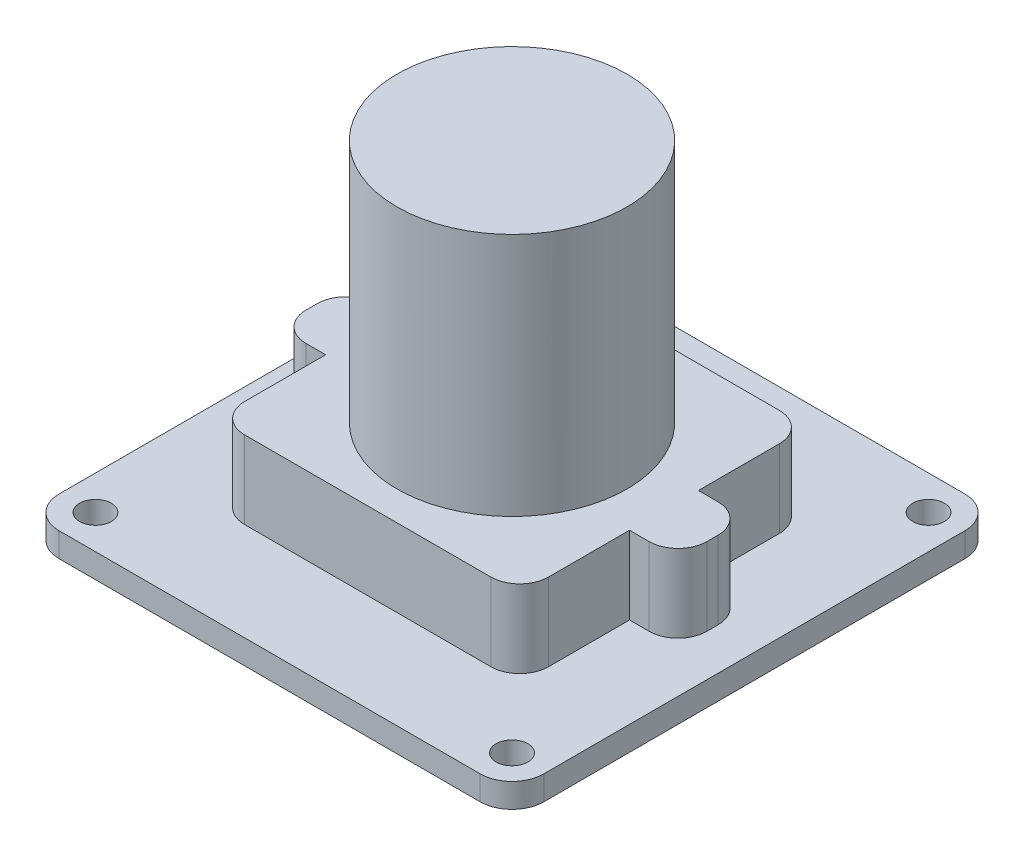
ISO-10303-21;
HEADER;
FILE_DESCRIPTION(('STEP AP214'),'2;1');
FILE_NAME('part.step','',(''),(''),'','','');
FILE_SCHEMA(('AUTOMOTIVE_DESIGN { 1 0 10303 214 1 1 1 1 }'));
ENDSEC;
DATA;
#1=APPLICATION_CONTEXT('core data for automotive mechanical design processes');
#2=APPLICATION_PROTOCOL_DEFINITION('international standard','automotive_design',2000,#1);
#3=PRODUCT_CONTEXT('',#1,'mechanical');
#4=PRODUCT('Part','Part','',(#3));
#5=PRODUCT_RELATED_PRODUCT_CATEGORY('part','',(#4));
#6=PRODUCT_DEFINITION_FORMATION('','',#4);
#7=PRODUCT_DEFINITION_CONTEXT('part definition',#1,'design');
#8=PRODUCT_DEFINITION('design','',#6,#7);
#9=PRODUCT_DEFINITION_SHAPE('','',#8);
#10=(LENGTH_UNIT() NAMED_UNIT(*) SI_UNIT(.MILLI.,.METRE.));
#11=(NAMED_UNIT(*) PLANE_ANGLE_UNIT() SI_UNIT($,.RADIAN.));
#12=(NAMED_UNIT(*) SI_UNIT($,.STERADIAN.) SOLID_ANGLE_UNIT());
#13=UNCERTAINTY_MEASURE_WITH_UNIT(LENGTH_MEASURE(1.E-05),#10,'distance_accuracy_value','');
#14=(GEOMETRIC_REPRESENTATION_CONTEXT(3) GLOBAL_UNCERTAINTY_ASSIGNED_CONTEXT((#13)) GLOBAL_UNIT_ASSIGNED_CONTEXT((#10,
#11,#12)) REPRESENTATION_CONTEXT('',''));
#15=CARTESIAN_POINT('',(0.,0.,0.));
#16=DIRECTION('',(0.,0.,1.));
#17=DIRECTION('',(1.,0.,0.));
#18=AXIS2_PLACEMENT_3D('',#15,#16,#17);
#19=CARTESIAN_POINT('',(0.,1.6002,0.));
#20=DIRECTION('',(0.,1.,0.));
#21=DIRECTION('',(0.,0.,1.));
#22=AXIS2_PLACEMENT_3D('',#19,#20,#21);
#23=PLANE('',#22);
#24=CARTESIAN_POINT('',(-13.75,1.6002,13.7500106));
#25=DIRECTION('',(0.,1.,0.));
#26=DIRECTION('',(0.,0.,1.));
#27=AXIS2_PLACEMENT_3D('',#24,#25,#26);
#28=CIRCLE('',#27,1.04775);
#29=CARTESIAN_POINT('',(-13.75,1.6002,14.7977606));
#30=VERTEX_POINT('',#29);
#31=EDGE_CURVE('E301',#30,#30,#28,.T.);
#32=ORIENTED_EDGE('',*,*,#31,.F.);
#33=EDGE_LOOP('',(#32));
#34=FACE_BOUND('',#33,.T.);
#35=CARTESIAN_POINT('',(13.7500106,1.6002,-13.7500106));
#36=DIRECTION('',(0.,1.,0.));
#37=DIRECTION('',(0.,0.,1.));
#38=AXIS2_PLACEMENT_3D('',#35,#36,#37);
#39=CIRCLE('',#38,1.04775);
#40=CARTESIAN_POINT('',(13.7500106,1.6002,-12.7022606));
#41=VERTEX_POINT('',#40);
#42=EDGE_CURVE('E317',#41,#41,#39,.T.);
#43=ORIENTED_EDGE('',*,*,#42,.F.);
#44=EDGE_LOOP('',(#43));
#45=FACE_BOUND('',#44,.T.);
#46=DIRECTION('',(-1.,0.,0.));
#47=VECTOR('',#46,1.);
#48=CARTESIAN_POINT('',(-16.,1.6002,-16.));
#49=LINE('',#48,#47);
#50=CARTESIAN_POINT('',(13.9,1.6002,-16.));
#51=VERTEX_POINT('',#50);
#52=CARTESIAN_POINT('',(-13.9,1.6002,-16.));
#53=VERTEX_POINT('',#52);
#54=EDGE_CURVE('E335',#51,#53,#49,.T.);
#55=ORIENTED_EDGE('',*,*,#54,.T.);
#56=CARTESIAN_POINT('',(-13.9,1.6002,-13.9));
#57=DIRECTION('',(0.,1.,0.));
#58=DIRECTION('',(0.,0.,1.));
#59=AXIS2_PLACEMENT_3D('',#56,#57,#58);
#60=CIRCLE('',#59,2.1);
#61=CARTESIAN_POINT('',(-16.,1.6002,-13.9));
#62=VERTEX_POINT('',#61);
#63=EDGE_CURVE('E379',#53,#62,#60,.T.);
#64=ORIENTED_EDGE('',*,*,#63,.T.);
#65=DIRECTION('',(0.,0.,1.));
#66=VECTOR('',#65,1.);
#67=CARTESIAN_POINT('',(-16.,1.6002,-16.));
#68=LINE('',#67,#66);
#69=CARTESIAN_POINT('',(-16.,1.6002,13.9));
#70=VERTEX_POINT('',#69);
#71=EDGE_CURVE('E323',#62,#70,#68,.T.);
#72=ORIENTED_EDGE('',*,*,#71,.T.);
#73=CARTESIAN_POINT('',(-13.9,1.6002,13.9));
#74=DIRECTION('',(0.,1.,0.));
#75=DIRECTION('',(0.,0.,1.));
#76=AXIS2_PLACEMENT_3D('',#73,#74,#75);
#77=CIRCLE('',#76,2.1);
#78=CARTESIAN_POINT('',(-13.9,1.6002,16.));
#79=VERTEX_POINT('',#78);
#80=EDGE_CURVE('E372',#70,#79,#77,.T.);
#81=ORIENTED_EDGE('',*,*,#80,.T.);
#82=DIRECTION('',(1.,0.,0.));
#83=VECTOR('',#82,1.);
#84=CARTESIAN_POINT('',(-16.,1.6002,16.));
#85=LINE('',#84,#83);
#86=CARTESIAN_POINT('',(13.9,1.6002,16.));
#87=VERTEX_POINT('',#86);
#88=EDGE_CURVE('E327',#79,#87,#85,.T.);
#89=ORIENTED_EDGE('',*,*,#88,.T.);
#90=CARTESIAN_POINT('',(13.9,1.6002,13.9));
#91=DIRECTION('',(0.,1.,0.));
#92=DIRECTION('',(0.,0.,1.));
#93=AXIS2_PLACEMENT_3D('',#90,#91,#92);
#94=CIRCLE('',#93,2.1);
#95=CARTESIAN_POINT('',(16.,1.6002,13.9));
#96=VERTEX_POINT('',#95);
#97=EDGE_CURVE('E375',#87,#96,#94,.T.);
#98=ORIENTED_EDGE('',*,*,#97,.T.);
#99=DIRECTION('',(0.,0.,-1.));
#100=VECTOR('',#99,1.);
#101=CARTESIAN_POINT('',(16.,1.6002,-16.));
#102=LINE('',#101,#100);
#103=CARTESIAN_POINT('',(16.,1.6002,-13.9));
#104=VERTEX_POINT('',#103);
#105=EDGE_CURVE('E332',#96,#104,#102,.T.);
#106=ORIENTED_EDGE('',*,*,#105,.T.);
#107=CARTESIAN_POINT('',(13.9,1.6002,-13.9));
#108=DIRECTION('',(0.,1.,0.));
#109=DIRECTION('',(0.,0.,1.));
#110=AXIS2_PLACEMENT_3D('',#107,#108,#109);
#111=CIRCLE('',#110,2.1);
#112=EDGE_CURVE('E377',#104,#51,#111,.T.);
#113=ORIENTED_EDGE('',*,*,#112,.T.);
#114=EDGE_LOOP('',(#55,#64,#72,#81,#89,#98,#106,#113));
#115=FACE_BOUND('',#114,.T.);
#116=CARTESIAN_POINT('',(-13.7500106,1.6002,-13.7500106));
#117=DIRECTION('',(0.,1.,0.));
#118=DIRECTION('',(0.,0.,1.));
#119=AXIS2_PLACEMENT_3D('',#116,#117,#118);
#120=CIRCLE('',#119,1.04775);
#121=CARTESIAN_POINT('',(-13.7500106,1.6002,-12.7022606));
#122=VERTEX_POINT('',#121);
#123=EDGE_CURVE('E309',#122,#122,#120,.T.);
#124=ORIENTED_EDGE('',*,*,#123,.F.);
#125=EDGE_LOOP('',(#124));
#126=FACE_BOUND('',#125,.T.);
#127=CARTESIAN_POINT('',(13.7500106,1.6002,13.7500106));
#128=DIRECTION('',(0.,1.,0.));
#129=DIRECTION('',(0.,0.,1.));
#130=AXIS2_PLACEMENT_3D('',#127,#128,#129);
#131=CIRCLE('',#130,1.04775);
#132=CARTESIAN_POINT('',(13.7500106,1.6002,14.7977606));
#133=VERTEX_POINT('',#132);
#134=EDGE_CURVE('E290',#133,#133,#131,.T.);
#135=ORIENTED_EDGE('',*,*,#134,.F.);
#136=EDGE_LOOP('',(#135));
#137=FACE_BOUND('',#136,.T.);
#138=DIRECTION('',(-1.,0.,0.));
#139=VECTOR('',#138,1.);
#140=CARTESIAN_POINT('',(-10.033,1.6002,-2.2733));
#141=LINE('',#140,#139);
#142=CARTESIAN_POINT('',(-10.033,1.6002,-2.2733));
#143=VERTEX_POINT('',#142);
#144=CARTESIAN_POINT('',(-11.3284,1.6002,-2.2733));
#145=VERTEX_POINT('',#144);
#146=EDGE_CURVE('E482',#143,#145,#141,.T.);
#147=ORIENTED_EDGE('',*,*,#146,.F.);
#148=DIRECTION('',(0.,0.,1.));
#149=VECTOR('',#148,1.);
#150=CARTESIAN_POINT('',(-10.033,1.6002,-9.525));
#151=LINE('',#150,#149);
#152=CARTESIAN_POINT('',(-10.033,1.6002,-7.62));
#153=VERTEX_POINT('',#152);
#154=EDGE_CURVE('E284',#153,#143,#151,.T.);
#155=ORIENTED_EDGE('',*,*,#154,.F.);
#156=CARTESIAN_POINT('',(-8.128,1.6002,-7.62));
#157=DIRECTION('',(0.,1.,0.));
#158=DIRECTION('',(0.,0.,1.));
#159=AXIS2_PLACEMENT_3D('',#156,#157,#158);
#160=CIRCLE('',#159,1.905);
#161=CARTESIAN_POINT('',(-8.128,1.6002,-9.525));
#162=VERTEX_POINT('',#161);
#163=EDGE_CURVE('E69',#153,#162,#160,.F.);
#164=ORIENTED_EDGE('',*,*,#163,.T.);
#165=DIRECTION('',(-1.,0.,0.));
#166=VECTOR('',#165,1.);
#167=CARTESIAN_POINT('',(-10.033,1.6002,-9.525));
#168=LINE('',#167,#166);
#169=CARTESIAN_POINT('',(8.128,1.6002,-9.525));
#170=VERTEX_POINT('',#169);
#171=EDGE_CURVE('E270',#170,#162,#168,.T.);
#172=ORIENTED_EDGE('',*,*,#171,.F.);
#173=CARTESIAN_POINT('',(8.128,1.6002,-7.62));
#174=DIRECTION('',(0.,1.,0.));
#175=DIRECTION('',(0.,0.,1.));
#176=AXIS2_PLACEMENT_3D('',#173,#174,#175);
#177=CIRCLE('',#176,1.905);
#178=CARTESIAN_POINT('',(10.033,1.6002,-7.62));
#179=VERTEX_POINT('',#178);
#180=EDGE_CURVE('E54',#170,#179,#177,.F.);
#181=ORIENTED_EDGE('',*,*,#180,.T.);
#182=DIRECTION('',(0.,0.,-1.));
#183=VECTOR('',#182,1.);
#184=CARTESIAN_POINT('',(10.033,1.6002,-9.525));
#185=LINE('',#184,#183);
#186=CARTESIAN_POINT('',(10.033,1.6002,-2.2733));
#187=VERTEX_POINT('',#186);
#188=EDGE_CURVE('E475',#187,#179,#185,.T.);
#189=ORIENTED_EDGE('',*,*,#188,.F.);
#190=DIRECTION('',(-1.,0.,0.));
#191=VECTOR('',#190,1.);
#192=CARTESIAN_POINT('',(10.033,1.6002,-2.2733));
#193=LINE('',#192,#191);
#194=CARTESIAN_POINT('',(11.3284,1.6002,-2.2733));
#195=VERTEX_POINT('',#194);
#196=EDGE_CURVE('E539',#195,#187,#193,.T.);
#197=ORIENTED_EDGE('',*,*,#196,.F.);
#198=CARTESIAN_POINT('',(11.3284,1.6002,-0.368300000000005));
#199=DIRECTION('',(0.,1.,0.));
#200=DIRECTION('',(0.,0.,1.));
#201=AXIS2_PLACEMENT_3D('',#198,#199,#200);
#202=CIRCLE('',#201,1.905);
#203=CARTESIAN_POINT('',(13.2334,1.6002,-0.368300000000005));
#204=VERTEX_POINT('',#203);
#205=EDGE_CURVE('E458',#195,#204,#202,.F.);
#206=ORIENTED_EDGE('',*,*,#205,.T.);
#207=DIRECTION('',(0.,0.,-1.));
#208=VECTOR('',#207,1.);
#209=CARTESIAN_POINT('',(13.2334,1.6002,-2.27330000000001));
#210=LINE('',#209,#208);
#211=CARTESIAN_POINT('',(13.2334,1.6002,0.368300000000002));
#212=VERTEX_POINT('',#211);
#213=EDGE_CURVE('E536',#212,#204,#210,.T.);
#214=ORIENTED_EDGE('',*,*,#213,.F.);
#215=CARTESIAN_POINT('',(11.3284,1.6002,0.368300000000002));
#216=DIRECTION('',(0.,1.,0.));
#217=DIRECTION('',(0.,0.,1.));
#218=AXIS2_PLACEMENT_3D('',#215,#216,#217);
#219=CIRCLE('',#218,1.905);
#220=CARTESIAN_POINT('',(11.3284,1.6002,2.2733));
#221=VERTEX_POINT('',#220);
#222=EDGE_CURVE('E460',#212,#221,#219,.F.);
#223=ORIENTED_EDGE('',*,*,#222,.T.);
#224=DIRECTION('',(1.,0.,0.));
#225=VECTOR('',#224,1.);
#226=CARTESIAN_POINT('',(13.2334,1.6002,2.2733));
#227=LINE('',#226,#225);
#228=CARTESIAN_POINT('',(10.033,1.6002,2.2733));
#229=VERTEX_POINT('',#228);
#230=EDGE_CURVE('E533',#229,#221,#227,.T.);
#231=ORIENTED_EDGE('',*,*,#230,.F.);
#232=DIRECTION('',(0.,0.,-1.));
#233=VECTOR('',#232,1.);
#234=CARTESIAN_POINT('',(10.033,1.6002,2.2733));
#235=LINE('',#234,#233);
#236=CARTESIAN_POINT('',(10.033,1.6002,7.62));
#237=VERTEX_POINT('',#236);
#238=EDGE_CURVE('E497',#237,#229,#235,.T.);
#239=ORIENTED_EDGE('',*,*,#238,.F.);
#240=CARTESIAN_POINT('',(8.128,1.6002,7.62));
#241=DIRECTION('',(0.,1.,0.));
#242=DIRECTION('',(0.,0.,1.));
#243=AXIS2_PLACEMENT_3D('',#240,#241,#242);
#244=CIRCLE('',#243,1.905);
#245=CARTESIAN_POINT('',(8.128,1.6002,9.525));
#246=VERTEX_POINT('',#245);
#247=EDGE_CURVE('E462',#237,#246,#244,.F.);
#248=ORIENTED_EDGE('',*,*,#247,.T.);
#249=DIRECTION('',(1.,0.,0.));
#250=VECTOR('',#249,1.);
#251=CARTESIAN_POINT('',(-10.033,1.6002,9.525));
#252=LINE('',#251,#250);
#253=CARTESIAN_POINT('',(-8.128,1.6002,9.525));
#254=VERTEX_POINT('',#253);
#255=EDGE_CURVE('E493',#254,#246,#252,.T.);
#256=ORIENTED_EDGE('',*,*,#255,.F.);
#257=CARTESIAN_POINT('',(-8.128,1.6002,7.62));
#258=DIRECTION('',(0.,1.,0.));
#259=DIRECTION('',(0.,0.,1.));
#260=AXIS2_PLACEMENT_3D('',#257,#258,#259);
#261=CIRCLE('',#260,1.905);
#262=CARTESIAN_POINT('',(-10.033,1.6002,7.62));
#263=VERTEX_POINT('',#262);
#264=EDGE_CURVE('E464',#254,#263,#261,.F.);
#265=ORIENTED_EDGE('',*,*,#264,.T.);
#266=DIRECTION('',(0.,0.,1.));
#267=VECTOR('',#266,1.);
#268=CARTESIAN_POINT('',(-10.033,1.6002,2.2733));
#269=LINE('',#268,#267);
#270=CARTESIAN_POINT('',(-10.033,1.6002,2.2733));
#271=VERTEX_POINT('',#270);
#272=EDGE_CURVE('E489',#271,#263,#269,.T.);
#273=ORIENTED_EDGE('',*,*,#272,.F.);
#274=DIRECTION('',(1.,0.,0.));
#275=VECTOR('',#274,1.);
#276=CARTESIAN_POINT('',(-13.2334,1.6002,2.2733));
#277=LINE('',#276,#275);
#278=CARTESIAN_POINT('',(-11.3284,1.6002,2.2733));
#279=VERTEX_POINT('',#278);
#280=EDGE_CURVE('E481',#279,#271,#277,.T.);
#281=ORIENTED_EDGE('',*,*,#280,.F.);
#282=CARTESIAN_POINT('',(-11.3284,1.6002,0.368300000000002));
#283=DIRECTION('',(0.,1.,0.));
#284=DIRECTION('',(0.,0.,1.));
#285=AXIS2_PLACEMENT_3D('',#282,#283,#284);
#286=CIRCLE('',#285,1.905);
#287=CARTESIAN_POINT('',(-13.2334,1.6002,0.368300000000002));
#288=VERTEX_POINT('',#287);
#289=EDGE_CURVE('E467',#279,#288,#286,.F.);
#290=ORIENTED_EDGE('',*,*,#289,.T.);
#291=DIRECTION('',(0.,0.,1.));
#292=VECTOR('',#291,1.);
#293=CARTESIAN_POINT('',(-13.2334,1.6002,-2.2733));
#294=LINE('',#293,#292);
#295=CARTESIAN_POINT('',(-13.2334,1.6002,-0.368300000000001));
#296=VERTEX_POINT('',#295);
#297=EDGE_CURVE('E478',#296,#288,#294,.T.);
#298=ORIENTED_EDGE('',*,*,#297,.F.);
#299=CARTESIAN_POINT('',(-11.3284,1.6002,-0.368300000000002));
#300=DIRECTION('',(0.,1.,0.));
#301=DIRECTION('',(0.,0.,1.));
#302=AXIS2_PLACEMENT_3D('',#299,#300,#301);
#303=CIRCLE('',#302,1.905);
#304=EDGE_CURVE('E470',#296,#145,#303,.F.);
#305=ORIENTED_EDGE('',*,*,#304,.T.);
#306=EDGE_LOOP('',(#147,#155,#164,#172,#181,#189,#197,#206,#214,#223,#231,#239,#248,#256,#265,
#273,#281,#290,#298,#305));
#307=FACE_BOUND('',#306,.T.);
#308=ADVANCED_FACE('F45',(#34,#45,#115,#126,#137,#307),#23,.T.);
#309=CARTESIAN_POINT('',(0.,0.,0.));
#310=DIRECTION('',(0.,1.,0.));
#311=DIRECTION('',(0.,0.,1.));
#312=AXIS2_PLACEMENT_3D('',#309,#310,#311);
#313=PLANE('',#312);
#314=DIRECTION('',(0.,0.,1.));
#315=VECTOR('',#314,1.);
#316=CARTESIAN_POINT('',(-16.,0.,-16.));
#317=LINE('',#316,#315);
#318=CARTESIAN_POINT('',(-16.,0.,-13.9));
#319=VERTEX_POINT('',#318);
#320=CARTESIAN_POINT('',(-16.,0.,13.9));
#321=VERTEX_POINT('',#320);
#322=EDGE_CURVE('E320',#319,#321,#317,.T.);
#323=ORIENTED_EDGE('',*,*,#322,.F.);
#324=CARTESIAN_POINT('',(-13.9,0.,-13.9));
#325=DIRECTION('',(0.,1.,0.));
#326=DIRECTION('',(0.,0.,1.));
#327=AXIS2_PLACEMENT_3D('',#324,#325,#326);
#328=CIRCLE('',#327,2.1);
#329=CARTESIAN_POINT('',(-13.9,0.,-16.));
#330=VERTEX_POINT('',#329);
#331=EDGE_CURVE('E364',#319,#330,#328,.F.);
#332=ORIENTED_EDGE('',*,*,#331,.T.);
#333=DIRECTION('',(-1.,0.,0.));
#334=VECTOR('',#333,1.);
#335=CARTESIAN_POINT('',(-16.,0.,-16.));
#336=LINE('',#335,#334);
#337=CARTESIAN_POINT('',(13.9,0.,-16.));
#338=VERTEX_POINT('',#337);
#339=EDGE_CURVE('E328',#338,#330,#336,.T.);
#340=ORIENTED_EDGE('',*,*,#339,.F.);
#341=CARTESIAN_POINT('',(13.9,0.,-13.9));
#342=DIRECTION('',(0.,1.,0.));
#343=DIRECTION('',(0.,0.,1.));
#344=AXIS2_PLACEMENT_3D('',#341,#342,#343);
#345=CIRCLE('',#344,2.1);
#346=CARTESIAN_POINT('',(16.,0.,-13.9));
#347=VERTEX_POINT('',#346);
#348=EDGE_CURVE('E362',#338,#347,#345,.F.);
#349=ORIENTED_EDGE('',*,*,#348,.T.);
#350=DIRECTION('',(0.,0.,-1.));
#351=VECTOR('',#350,1.);
#352=CARTESIAN_POINT('',(16.,0.,-16.));
#353=LINE('',#352,#351);
#354=CARTESIAN_POINT('',(16.,0.,13.9));
#355=VERTEX_POINT('',#354);
#356=EDGE_CURVE('E346',#355,#347,#353,.T.);
#357=ORIENTED_EDGE('',*,*,#356,.F.);
#358=CARTESIAN_POINT('',(13.9,0.,13.9));
#359=DIRECTION('',(0.,1.,0.));
#360=DIRECTION('',(0.,0.,1.));
#361=AXIS2_PLACEMENT_3D('',#358,#359,#360);
#362=CIRCLE('',#361,2.1);
#363=CARTESIAN_POINT('',(13.9,0.,16.));
#364=VERTEX_POINT('',#363);
#365=EDGE_CURVE('E360',#355,#364,#362,.F.);
#366=ORIENTED_EDGE('',*,*,#365,.T.);
#367=DIRECTION('',(1.,0.,0.));
#368=VECTOR('',#367,1.);
#369=CARTESIAN_POINT('',(-16.,0.,16.));
#370=LINE('',#369,#368);
#371=CARTESIAN_POINT('',(-13.9,0.,16.));
#372=VERTEX_POINT('',#371);
#373=EDGE_CURVE('E342',#372,#364,#370,.T.);
#374=ORIENTED_EDGE('',*,*,#373,.F.);
#375=CARTESIAN_POINT('',(-13.9,0.,13.9));
#376=DIRECTION('',(0.,1.,0.));
#377=DIRECTION('',(0.,0.,1.));
#378=AXIS2_PLACEMENT_3D('',#375,#376,#377);
#379=CIRCLE('',#378,2.1);
#380=EDGE_CURVE('E357',#372,#321,#379,.F.);
#381=ORIENTED_EDGE('',*,*,#380,.T.);
#382=EDGE_LOOP('',(#323,#332,#340,#349,#357,#366,#374,#381));
#383=FACE_BOUND('',#382,.T.);
#384=CARTESIAN_POINT('',(13.7500106,0.,-13.7500106));
#385=DIRECTION('',(0.,1.,0.));
#386=DIRECTION('',(0.,0.,1.));
#387=AXIS2_PLACEMENT_3D('',#384,#385,#386);
#388=CIRCLE('',#387,1.04775);
#389=CARTESIAN_POINT('',(13.7500106,0.,-12.7022606));
#390=VERTEX_POINT('',#389);
#391=EDGE_CURVE('E313',#390,#390,#388,.T.);
#392=ORIENTED_EDGE('',*,*,#391,.T.);
#393=EDGE_LOOP('',(#392));
#394=FACE_BOUND('',#393,.T.);
#395=CARTESIAN_POINT('',(-13.7500106,0.,-13.7500106));
#396=DIRECTION('',(0.,1.,0.));
#397=DIRECTION('',(0.,0.,1.));
#398=AXIS2_PLACEMENT_3D('',#395,#396,#397);
#399=CIRCLE('',#398,1.04775);
#400=CARTESIAN_POINT('',(-13.7500106,0.,-12.7022606));
#401=VERTEX_POINT('',#400);
#402=EDGE_CURVE('E305',#401,#401,#399,.T.);
#403=ORIENTED_EDGE('',*,*,#402,.T.);
#404=EDGE_LOOP('',(#403));
#405=FACE_BOUND('',#404,.T.);
#406=CARTESIAN_POINT('',(-13.75,0.,13.7500106));
#407=DIRECTION('',(0.,1.,0.));
#408=DIRECTION('',(0.,0.,1.));
#409=AXIS2_PLACEMENT_3D('',#406,#407,#408);
#410=CIRCLE('',#409,1.04775);
#411=CARTESIAN_POINT('',(-13.75,0.,14.7977606));
#412=VERTEX_POINT('',#411);
#413=EDGE_CURVE('E299',#412,#412,#410,.T.);
#414=ORIENTED_EDGE('',*,*,#413,.T.);
#415=EDGE_LOOP('',(#414));
#416=FACE_BOUND('',#415,.T.);
#417=CARTESIAN_POINT('',(13.7500106,0.,13.7500106));
#418=DIRECTION('',(0.,1.,0.));
#419=DIRECTION('',(0.,0.,1.));
#420=AXIS2_PLACEMENT_3D('',#417,#418,#419);
#421=CIRCLE('',#420,1.04775);
#422=CARTESIAN_POINT('',(13.7500106,0.,14.7977606));
#423=VERTEX_POINT('',#422);
#424=EDGE_CURVE('E286',#423,#423,#421,.T.);
#425=ORIENTED_EDGE('',*,*,#424,.T.);
#426=EDGE_LOOP('',(#425));
#427=FACE_BOUND('',#426,.T.);
#428=ADVANCED_FACE('F627',(#383,#394,#405,#416,#427),#313,.F.);
#429=CARTESIAN_POINT('',(-16.,1.6002,-16.));
#430=DIRECTION('',(1.,0.,0.));
#431=DIRECTION('',(0.,0.,-1.));
#432=AXIS2_PLACEMENT_3D('',#429,#430,#431);
#433=PLANE('',#432);
#434=ORIENTED_EDGE('',*,*,#71,.F.);
#435=DIRECTION('',(0.,-1.,0.));
#436=VECTOR('',#435,1.);
#437=CARTESIAN_POINT('',(-16.,1.6002,-13.9));
#438=LINE('',#437,#436);
#439=EDGE_CURVE('E353',#62,#319,#438,.T.);
#440=ORIENTED_EDGE('',*,*,#439,.T.);
#441=ORIENTED_EDGE('',*,*,#322,.T.);
#442=DIRECTION('',(0.,-1.,0.));
#443=VECTOR('',#442,1.);
#444=CARTESIAN_POINT('',(-16.,1.6002,13.9));
#445=LINE('',#444,#443);
#446=EDGE_CURVE('E338',#321,#70,#445,.F.);
#447=ORIENTED_EDGE('',*,*,#446,.T.);
#448=EDGE_LOOP('',(#434,#440,#441,#447));
#449=FACE_BOUND('',#448,.T.);
#450=ADVANCED_FACE('F633',(#449),#433,.F.);
#451=CARTESIAN_POINT('',(-16.,1.6002,16.));
#452=DIRECTION('',(0.,0.,-1.));
#453=DIRECTION('',(-1.,0.,0.));
#454=AXIS2_PLACEMENT_3D('',#451,#452,#453);
#455=PLANE('',#454);
#456=ORIENTED_EDGE('',*,*,#373,.T.);
#457=DIRECTION('',(0.,-1.,0.));
#458=VECTOR('',#457,1.);
#459=CARTESIAN_POINT('',(13.9,1.6002,16.));
#460=LINE('',#459,#458);
#461=EDGE_CURVE('E391',#364,#87,#460,.F.);
#462=ORIENTED_EDGE('',*,*,#461,.T.);
#463=ORIENTED_EDGE('',*,*,#88,.F.);
#464=DIRECTION('',(0.,-1.,0.));
#465=VECTOR('',#464,1.);
#466=CARTESIAN_POINT('',(-13.9,1.6002,16.));
#467=LINE('',#466,#465);
#468=EDGE_CURVE('E387',#79,#372,#467,.T.);
#469=ORIENTED_EDGE('',*,*,#468,.T.);
#470=EDGE_LOOP('',(#456,#462,#463,#469));
#471=FACE_BOUND('',#470,.T.);
#472=ADVANCED_FACE('F649',(#471),#455,.F.);
#473=CARTESIAN_POINT('',(16.,1.6002,-16.));
#474=DIRECTION('',(-1.,0.,0.));
#475=DIRECTION('',(0.,0.,1.));
#476=AXIS2_PLACEMENT_3D('',#473,#474,#475);
#477=PLANE('',#476);
#478=ORIENTED_EDGE('',*,*,#356,.T.);
#479=DIRECTION('',(0.,-1.,0.));
#480=VECTOR('',#479,1.);
#481=CARTESIAN_POINT('',(16.,1.6002,-13.9));
#482=LINE('',#481,#480);
#483=EDGE_CURVE('E385',#347,#104,#482,.F.);
#484=ORIENTED_EDGE('',*,*,#483,.T.);
#485=ORIENTED_EDGE('',*,*,#105,.F.);
#486=DIRECTION('',(0.,-1.,0.));
#487=VECTOR('',#486,1.);
#488=CARTESIAN_POINT('',(16.,1.6002,13.9));
#489=LINE('',#488,#487);
#490=EDGE_CURVE('E382',#96,#355,#489,.T.);
#491=ORIENTED_EDGE('',*,*,#490,.T.);
#492=EDGE_LOOP('',(#478,#484,#485,#491));
#493=FACE_BOUND('',#492,.T.);
#494=ADVANCED_FACE('F645',(#493),#477,.F.);
#495=CARTESIAN_POINT('',(-16.,1.6002,-16.));
#496=DIRECTION('',(0.,0.,1.));
#497=DIRECTION('',(1.,0.,0.));
#498=AXIS2_PLACEMENT_3D('',#495,#496,#497);
#499=PLANE('',#498);
#500=ORIENTED_EDGE('',*,*,#339,.T.);
#501=DIRECTION('',(0.,-1.,0.));
#502=VECTOR('',#501,1.);
#503=CARTESIAN_POINT('',(-13.9,1.6002,-16.));
#504=LINE('',#503,#502);
#505=EDGE_CURVE('E370',#330,#53,#504,.F.);
#506=ORIENTED_EDGE('',*,*,#505,.T.);
#507=ORIENTED_EDGE('',*,*,#54,.F.);
#508=DIRECTION('',(0.,-1.,0.));
#509=VECTOR('',#508,1.);
#510=CARTESIAN_POINT('',(13.9,1.6002,-16.));
#511=LINE('',#510,#509);
#512=EDGE_CURVE('E367',#51,#338,#511,.T.);
#513=ORIENTED_EDGE('',*,*,#512,.T.);
#514=EDGE_LOOP('',(#500,#506,#507,#513));
#515=FACE_BOUND('',#514,.T.);
#516=ADVANCED_FACE('F642',(#515),#499,.F.);
#517=CARTESIAN_POINT('',(13.7500106,1.6002,-13.7500106));
#518=DIRECTION('',(0.,-1.,0.));
#519=DIRECTION('',(0.,0.,-1.));
#520=AXIS2_PLACEMENT_3D('',#517,#518,#519);
#521=CYLINDRICAL_SURFACE('',#520,1.04775);
#522=ORIENTED_EDGE('',*,*,#42,.T.);
#523=EDGE_LOOP('',(#522));
#524=FACE_BOUND('',#523,.T.);
#525=ORIENTED_EDGE('',*,*,#391,.F.);
#526=EDGE_LOOP('',(#525));
#527=FACE_BOUND('',#526,.T.);
#528=ADVANCED_FACE('F639',(#524,#527),#521,.F.);
#529=CARTESIAN_POINT('',(-13.7500106,1.6002,-13.7500106));
#530=DIRECTION('',(0.,-1.,0.));
#531=DIRECTION('',(0.,0.,-1.));
#532=AXIS2_PLACEMENT_3D('',#529,#530,#531);
#533=CYLINDRICAL_SURFACE('',#532,1.04775);
#534=ORIENTED_EDGE('',*,*,#123,.T.);
#535=EDGE_LOOP('',(#534));
#536=FACE_BOUND('',#535,.T.);
#537=ORIENTED_EDGE('',*,*,#402,.F.);
#538=EDGE_LOOP('',(#537));
#539=FACE_BOUND('',#538,.T.);
#540=ADVANCED_FACE('F893',(#536,#539),#533,.F.);
#541=CARTESIAN_POINT('',(-13.75,1.6002,13.7500106));
#542=DIRECTION('',(0.,-1.,0.));
#543=DIRECTION('',(0.,0.,-1.));
#544=AXIS2_PLACEMENT_3D('',#541,#542,#543);
#545=CYLINDRICAL_SURFACE('',#544,1.04775);
#546=ORIENTED_EDGE('',*,*,#31,.T.);
#547=EDGE_LOOP('',(#546));
#548=FACE_BOUND('',#547,.T.);
#549=ORIENTED_EDGE('',*,*,#413,.F.);
#550=EDGE_LOOP('',(#549));
#551=FACE_BOUND('',#550,.T.);
#552=ADVANCED_FACE('F883',(#548,#551),#545,.F.);
#553=CARTESIAN_POINT('',(13.7500106,1.6002,13.7500106));
#554=DIRECTION('',(0.,-1.,0.));
#555=DIRECTION('',(0.,0.,-1.));
#556=AXIS2_PLACEMENT_3D('',#553,#554,#555);
#557=CYLINDRICAL_SURFACE('',#556,1.04775);
#558=ORIENTED_EDGE('',*,*,#134,.T.);
#559=EDGE_LOOP('',(#558));
#560=FACE_BOUND('',#559,.T.);
#561=ORIENTED_EDGE('',*,*,#424,.F.);
#562=EDGE_LOOP('',(#561));
#563=FACE_BOUND('',#562,.T.);
#564=ADVANCED_FACE('F871',(#560,#563),#557,.F.);
#565=CARTESIAN_POINT('',(-10.033,6.731,-9.525));
#566=DIRECTION('',(1.,0.,0.));
#567=DIRECTION('',(0.,0.,-1.));
#568=AXIS2_PLACEMENT_3D('',#565,#566,#567);
#569=PLANE('',#568);
#570=DIRECTION('',(0.,0.,1.));
#571=VECTOR('',#570,1.);
#572=CARTESIAN_POINT('',(-10.033,6.731,-9.525));
#573=LINE('',#572,#571);
#574=CARTESIAN_POINT('',(-10.033,6.731,-7.62));
#575=VERTEX_POINT('',#574);
#576=CARTESIAN_POINT('',(-10.033,6.731,-2.2733));
#577=VERTEX_POINT('',#576);
#578=EDGE_CURVE('E256',#575,#577,#573,.T.);
#579=ORIENTED_EDGE('',*,*,#578,.F.);
#580=DIRECTION('',(0.,-1.,0.));
#581=VECTOR('',#580,1.);
#582=CARTESIAN_POINT('',(-10.033,6.731,-7.62));
#583=LINE('',#582,#581);
#584=EDGE_CURVE('E447',#575,#153,#583,.T.);
#585=ORIENTED_EDGE('',*,*,#584,.T.);
#586=ORIENTED_EDGE('',*,*,#154,.T.);
#587=DIRECTION('',(0.,-1.,0.));
#588=VECTOR('',#587,1.);
#589=CARTESIAN_POINT('',(-10.033,6.731,-2.2733));
#590=LINE('',#589,#588);
#591=EDGE_CURVE('E276',#577,#143,#590,.T.);
#592=ORIENTED_EDGE('',*,*,#591,.F.);
#593=EDGE_LOOP('',(#579,#585,#586,#592));
#594=FACE_BOUND('',#593,.T.);
#595=ADVANCED_FACE('F283',(#594),#569,.F.);
#596=CARTESIAN_POINT('',(-10.033,6.731,-2.2733));
#597=DIRECTION('',(0.,0.,1.));
#598=DIRECTION('',(1.,0.,0.));
#599=AXIS2_PLACEMENT_3D('',#596,#597,#598);
#600=PLANE('',#599);
#601=ORIENTED_EDGE('',*,*,#146,.T.);
#602=DIRECTION('',(0.,-1.,0.));
#603=VECTOR('',#602,1.);
#604=CARTESIAN_POINT('',(-11.3284,6.731,-2.2733));
#605=LINE('',#604,#603);
#606=CARTESIAN_POINT('',(-11.3284,6.731,-2.2733));
#607=VERTEX_POINT('',#606);
#608=EDGE_CURVE('E279',#145,#607,#605,.F.);
#609=ORIENTED_EDGE('',*,*,#608,.T.);
#610=DIRECTION('',(-1.,0.,0.));
#611=VECTOR('',#610,1.);
#612=CARTESIAN_POINT('',(-10.033,6.731,-2.2733));
#613=LINE('',#612,#611);
#614=EDGE_CURVE('E260',#577,#607,#613,.T.);
#615=ORIENTED_EDGE('',*,*,#614,.F.);
#616=ORIENTED_EDGE('',*,*,#591,.T.);
#617=EDGE_LOOP('',(#601,#609,#615,#616));
#618=FACE_BOUND('',#617,.T.);
#619=ADVANCED_FACE('F275',(#618),#600,.F.);
#620=CARTESIAN_POINT('',(-13.2334,6.731,-2.2733));
#621=DIRECTION('',(1.,0.,0.));
#622=DIRECTION('',(0.,0.,-1.));
#623=AXIS2_PLACEMENT_3D('',#620,#621,#622);
#624=PLANE('',#623);
#625=ORIENTED_EDGE('',*,*,#297,.T.);
#626=DIRECTION('',(0.,-1.,0.));
#627=VECTOR('',#626,1.);
#628=CARTESIAN_POINT('',(-13.2334,6.731,0.368300000000002));
#629=LINE('',#628,#627);
#630=CARTESIAN_POINT('',(-13.2334,6.731,0.368300000000002));
#631=VERTEX_POINT('',#630);
#632=EDGE_CURVE('E442',#288,#631,#629,.F.);
#633=ORIENTED_EDGE('',*,*,#632,.T.);
#634=DIRECTION('',(0.,0.,1.));
#635=VECTOR('',#634,1.);
#636=CARTESIAN_POINT('',(-13.2334,6.731,-2.2733));
#637=LINE('',#636,#635);
#638=CARTESIAN_POINT('',(-13.2334,6.731,-0.368300000000001));
#639=VERTEX_POINT('',#638);
#640=EDGE_CURVE('E281',#639,#631,#637,.T.);
#641=ORIENTED_EDGE('',*,*,#640,.F.);
#642=DIRECTION('',(0.,-1.,0.));
#643=VECTOR('',#642,1.);
#644=CARTESIAN_POINT('',(-13.2334,6.731,-0.368300000000001));
#645=LINE('',#644,#643);
#646=EDGE_CURVE('E438',#639,#296,#645,.T.);
#647=ORIENTED_EDGE('',*,*,#646,.T.);
#648=EDGE_LOOP('',(#625,#633,#641,#647));
#649=FACE_BOUND('',#648,.T.);
#650=ADVANCED_FACE('F589',(#649),#624,.F.);
#651=CARTESIAN_POINT('',(-13.2334,6.731,2.2733));
#652=DIRECTION('',(0.,0.,-1.));
#653=DIRECTION('',(-1.,0.,0.));
#654=AXIS2_PLACEMENT_3D('',#651,#652,#653);
#655=PLANE('',#654);
#656=DIRECTION('',(1.,0.,0.));
#657=VECTOR('',#656,1.);
#658=CARTESIAN_POINT('',(-13.2334,6.731,2.2733));
#659=LINE('',#658,#657);
#660=CARTESIAN_POINT('',(-11.3284,6.731,2.2733));
#661=VERTEX_POINT('',#660);
#662=CARTESIAN_POINT('',(-10.033,6.731,2.2733));
#663=VERTEX_POINT('',#662);
#664=EDGE_CURVE('E506',#661,#663,#659,.T.);
#665=ORIENTED_EDGE('',*,*,#664,.F.);
#666=DIRECTION('',(0.,-1.,0.));
#667=VECTOR('',#666,1.);
#668=CARTESIAN_POINT('',(-11.3284,6.731,2.2733));
#669=LINE('',#668,#667);
#670=EDGE_CURVE('E434',#661,#279,#669,.T.);
#671=ORIENTED_EDGE('',*,*,#670,.T.);
#672=ORIENTED_EDGE('',*,*,#280,.T.);
#673=DIRECTION('',(0.,-1.,0.));
#674=VECTOR('',#673,1.);
#675=CARTESIAN_POINT('',(-10.033,6.731,2.2733));
#676=LINE('',#675,#674);
#677=EDGE_CURVE('E287',#663,#271,#676,.T.);
#678=ORIENTED_EDGE('',*,*,#677,.F.);
#679=EDGE_LOOP('',(#665,#671,#672,#678));
#680=FACE_BOUND('',#679,.T.);
#681=ADVANCED_FACE('F597',(#680),#655,.F.);
#682=CARTESIAN_POINT('',(-10.033,6.731,2.2733));
#683=DIRECTION('',(1.,0.,0.));
#684=DIRECTION('',(0.,0.,-1.));
#685=AXIS2_PLACEMENT_3D('',#682,#683,#684);
#686=PLANE('',#685);
#687=ORIENTED_EDGE('',*,*,#272,.T.);
#688=DIRECTION('',(0.,-1.,0.));
#689=VECTOR('',#688,1.);
#690=CARTESIAN_POINT('',(-10.033,6.731,7.62));
#691=LINE('',#690,#689);
#692=CARTESIAN_POINT('',(-10.033,6.731,7.62));
#693=VERTEX_POINT('',#692);
#694=EDGE_CURVE('E431',#263,#693,#691,.F.);
#695=ORIENTED_EDGE('',*,*,#694,.T.);
#696=DIRECTION('',(0.,0.,1.));
#697=VECTOR('',#696,1.);
#698=CARTESIAN_POINT('',(-10.033,6.731,2.2733));
#699=LINE('',#698,#697);
#700=EDGE_CURVE('E511',#663,#693,#699,.T.);
#701=ORIENTED_EDGE('',*,*,#700,.F.);
#702=ORIENTED_EDGE('',*,*,#677,.T.);
#703=EDGE_LOOP('',(#687,#695,#701,#702));
#704=FACE_BOUND('',#703,.T.);
#705=ADVANCED_FACE('F602',(#704),#686,.F.);
#706=CARTESIAN_POINT('',(-10.033,6.731,9.525));
#707=DIRECTION('',(0.,0.,-1.));
#708=DIRECTION('',(-1.,0.,0.));
#709=AXIS2_PLACEMENT_3D('',#706,#707,#708);
#710=PLANE('',#709);
#711=ORIENTED_EDGE('',*,*,#255,.T.);
#712=DIRECTION('',(0.,-1.,0.));
#713=VECTOR('',#712,1.);
#714=CARTESIAN_POINT('',(8.128,6.731,9.525));
#715=LINE('',#714,#713);
#716=CARTESIAN_POINT('',(8.128,6.731,9.525));
#717=VERTEX_POINT('',#716);
#718=EDGE_CURVE('E429',#246,#717,#715,.F.);
#719=ORIENTED_EDGE('',*,*,#718,.T.);
#720=DIRECTION('',(1.,0.,0.));
#721=VECTOR('',#720,1.);
#722=CARTESIAN_POINT('',(-10.033,6.731,9.525));
#723=LINE('',#722,#721);
#724=CARTESIAN_POINT('',(-8.128,6.731,9.525));
#725=VERTEX_POINT('',#724);
#726=EDGE_CURVE('E517',#725,#717,#723,.T.);
#727=ORIENTED_EDGE('',*,*,#726,.F.);
#728=DIRECTION('',(0.,-1.,0.));
#729=VECTOR('',#728,1.);
#730=CARTESIAN_POINT('',(-8.128,6.731,9.525));
#731=LINE('',#730,#729);
#732=EDGE_CURVE('E425',#725,#254,#731,.T.);
#733=ORIENTED_EDGE('',*,*,#732,.T.);
#734=EDGE_LOOP('',(#711,#719,#727,#733));
#735=FACE_BOUND('',#734,.T.);
#736=ADVANCED_FACE('F611',(#735),#710,.F.);
#737=CARTESIAN_POINT('',(10.033,6.731,2.2733));
#738=DIRECTION('',(-1.,0.,0.));
#739=DIRECTION('',(0.,0.,1.));
#740=AXIS2_PLACEMENT_3D('',#737,#738,#739);
#741=PLANE('',#740);
#742=DIRECTION('',(0.,0.,-1.));
#743=VECTOR('',#742,1.);
#744=CARTESIAN_POINT('',(10.033,6.731,2.2733));
#745=LINE('',#744,#743);
#746=CARTESIAN_POINT('',(10.033,6.731,7.62));
#747=VERTEX_POINT('',#746);
#748=CARTESIAN_POINT('',(10.033,6.731,2.2733));
#749=VERTEX_POINT('',#748);
#750=EDGE_CURVE('E521',#747,#749,#745,.T.);
#751=ORIENTED_EDGE('',*,*,#750,.F.);
#752=DIRECTION('',(0.,-1.,0.));
#753=VECTOR('',#752,1.);
#754=CARTESIAN_POINT('',(10.033,6.731,7.62));
#755=LINE('',#754,#753);
#756=EDGE_CURVE('E422',#747,#237,#755,.T.);
#757=ORIENTED_EDGE('',*,*,#756,.T.);
#758=ORIENTED_EDGE('',*,*,#238,.T.);
#759=DIRECTION('',(0.,-1.,0.));
#760=VECTOR('',#759,1.);
#761=CARTESIAN_POINT('',(10.033,6.731,2.2733));
#762=LINE('',#761,#760);
#763=EDGE_CURVE('E294',#749,#229,#762,.T.);
#764=ORIENTED_EDGE('',*,*,#763,.F.);
#765=EDGE_LOOP('',(#751,#757,#758,#764));
#766=FACE_BOUND('',#765,.T.);
#767=ADVANCED_FACE('F617',(#766),#741,.F.);
#768=CARTESIAN_POINT('',(13.2334,6.731,2.2733));
#769=DIRECTION('',(0.,0.,-1.));
#770=DIRECTION('',(-1.,0.,0.));
#771=AXIS2_PLACEMENT_3D('',#768,#769,#770);
#772=PLANE('',#771);
#773=ORIENTED_EDGE('',*,*,#230,.T.);
#774=DIRECTION('',(0.,-1.,0.));
#775=VECTOR('',#774,1.);
#776=CARTESIAN_POINT('',(11.3284,6.731,2.2733));
#777=LINE('',#776,#775);
#778=CARTESIAN_POINT('',(11.3284,6.731,2.2733));
#779=VERTEX_POINT('',#778);
#780=EDGE_CURVE('E420',#221,#779,#777,.F.);
#781=ORIENTED_EDGE('',*,*,#780,.T.);
#782=DIRECTION('',(1.,0.,0.));
#783=VECTOR('',#782,1.);
#784=CARTESIAN_POINT('',(13.2334,6.731,2.2733));
#785=LINE('',#784,#783);
#786=EDGE_CURVE('E523',#749,#779,#785,.T.);
#787=ORIENTED_EDGE('',*,*,#786,.F.);
#788=ORIENTED_EDGE('',*,*,#763,.T.);
#789=EDGE_LOOP('',(#773,#781,#787,#788));
#790=FACE_BOUND('',#789,.T.);
#791=ADVANCED_FACE('F548',(#790),#772,.F.);
#792=CARTESIAN_POINT('',(13.2334,6.731,-2.27330000000001));
#793=DIRECTION('',(-1.,0.,0.));
#794=DIRECTION('',(0.,0.,1.));
#795=AXIS2_PLACEMENT_3D('',#792,#793,#794);
#796=PLANE('',#795);
#797=ORIENTED_EDGE('',*,*,#213,.T.);
#798=DIRECTION('',(0.,-1.,0.));
#799=VECTOR('',#798,1.);
#800=CARTESIAN_POINT('',(13.2334,6.731,-0.368300000000005));
#801=LINE('',#800,#799);
#802=CARTESIAN_POINT('',(13.2334,6.731,-0.368300000000005));
#803=VERTEX_POINT('',#802);
#804=EDGE_CURVE('E399',#204,#803,#801,.F.);
#805=ORIENTED_EDGE('',*,*,#804,.T.);
#806=DIRECTION('',(0.,0.,-1.));
#807=VECTOR('',#806,1.);
#808=CARTESIAN_POINT('',(13.2334,6.731,-2.27330000000001));
#809=LINE('',#808,#807);
#810=CARTESIAN_POINT('',(13.2334,6.731,0.368300000000002));
#811=VERTEX_POINT('',#810);
#812=EDGE_CURVE('E526',#811,#803,#809,.T.);
#813=ORIENTED_EDGE('',*,*,#812,.F.);
#814=DIRECTION('',(0.,-1.,0.));
#815=VECTOR('',#814,1.);
#816=CARTESIAN_POINT('',(13.2334,6.731,0.368300000000002));
#817=LINE('',#816,#815);
#818=EDGE_CURVE('E396',#811,#212,#817,.T.);
#819=ORIENTED_EDGE('',*,*,#818,.T.);
#820=EDGE_LOOP('',(#797,#805,#813,#819));
#821=FACE_BOUND('',#820,.T.);
#822=ADVANCED_FACE('F560',(#821),#796,.F.);
#823=CARTESIAN_POINT('',(10.033,6.731,-2.2733));
#824=DIRECTION('',(0.,0.,1.));
#825=DIRECTION('',(1.,0.,0.));
#826=AXIS2_PLACEMENT_3D('',#823,#824,#825);
#827=PLANE('',#826);
#828=DIRECTION('',(-1.,0.,0.));
#829=VECTOR('',#828,1.);
#830=CARTESIAN_POINT('',(10.033,6.731,-2.2733));
#831=LINE('',#830,#829);
#832=CARTESIAN_POINT('',(11.3284,6.731,-2.2733));
#833=VERTEX_POINT('',#832);
#834=CARTESIAN_POINT('',(10.033,6.731,-2.2733));
#835=VERTEX_POINT('',#834);
#836=EDGE_CURVE('E528',#833,#835,#831,.T.);
#837=ORIENTED_EDGE('',*,*,#836,.F.);
#838=DIRECTION('',(0.,-1.,0.));
#839=VECTOR('',#838,1.);
#840=CARTESIAN_POINT('',(11.3284,6.731,-2.2733));
#841=LINE('',#840,#839);
#842=EDGE_CURVE('E393',#833,#195,#841,.T.);
#843=ORIENTED_EDGE('',*,*,#842,.T.);
#844=ORIENTED_EDGE('',*,*,#196,.T.);
#845=DIRECTION('',(0.,-1.,0.));
#846=VECTOR('',#845,1.);
#847=CARTESIAN_POINT('',(10.033,6.731,-2.2733));
#848=LINE('',#847,#846);
#849=EDGE_CURVE('E501',#835,#187,#848,.T.);
#850=ORIENTED_EDGE('',*,*,#849,.F.);
#851=EDGE_LOOP('',(#837,#843,#844,#850));
#852=FACE_BOUND('',#851,.T.);
#853=ADVANCED_FACE('F569',(#852),#827,.F.);
#854=CARTESIAN_POINT('',(10.033,6.731,-9.525));
#855=DIRECTION('',(-1.,0.,0.));
#856=DIRECTION('',(0.,0.,1.));
#857=AXIS2_PLACEMENT_3D('',#854,#855,#856);
#858=PLANE('',#857);
#859=ORIENTED_EDGE('',*,*,#188,.T.);
#860=DIRECTION('',(0.,-1.,0.));
#861=VECTOR('',#860,1.);
#862=CARTESIAN_POINT('',(10.033,6.731,-7.62));
#863=LINE('',#862,#861);
#864=CARTESIAN_POINT('',(10.033,6.731,-7.62));
#865=VERTEX_POINT('',#864);
#866=EDGE_CURVE('E456',#179,#865,#863,.F.);
#867=ORIENTED_EDGE('',*,*,#866,.T.);
#868=DIRECTION('',(0.,0.,-1.));
#869=VECTOR('',#868,1.);
#870=CARTESIAN_POINT('',(10.033,6.731,-9.525));
#871=LINE('',#870,#869);
#872=EDGE_CURVE('E502',#835,#865,#871,.T.);
#873=ORIENTED_EDGE('',*,*,#872,.F.);
#874=ORIENTED_EDGE('',*,*,#849,.T.);
#875=EDGE_LOOP('',(#859,#867,#873,#874));
#876=FACE_BOUND('',#875,.T.);
#877=ADVANCED_FACE('F573',(#876),#858,.F.);
#878=CARTESIAN_POINT('',(-10.033,6.731,-9.525));
#879=DIRECTION('',(0.,0.,1.));
#880=DIRECTION('',(1.,0.,0.));
#881=AXIS2_PLACEMENT_3D('',#878,#879,#880);
#882=PLANE('',#881);
#883=ORIENTED_EDGE('',*,*,#171,.T.);
#884=DIRECTION('',(0.,-1.,0.));
#885=VECTOR('',#884,1.);
#886=CARTESIAN_POINT('',(-8.128,6.731,-9.525));
#887=LINE('',#886,#885);
#888=CARTESIAN_POINT('',(-8.128,6.731,-9.525));
#889=VERTEX_POINT('',#888);
#890=EDGE_CURVE('E453',#162,#889,#887,.F.);
#891=ORIENTED_EDGE('',*,*,#890,.T.);
#892=DIRECTION('',(-1.,0.,0.));
#893=VECTOR('',#892,1.);
#894=CARTESIAN_POINT('',(-10.033,6.731,-9.525));
#895=LINE('',#894,#893);
#896=CARTESIAN_POINT('',(8.128,6.731,-9.525));
#897=VERTEX_POINT('',#896);
#898=EDGE_CURVE('E500',#897,#889,#895,.T.);
#899=ORIENTED_EDGE('',*,*,#898,.F.);
#900=DIRECTION('',(0.,-1.,0.));
#901=VECTOR('',#900,1.);
#902=CARTESIAN_POINT('',(8.128,6.731,-9.525));
#903=LINE('',#902,#901);
#904=EDGE_CURVE('E450',#897,#170,#903,.T.);
#905=ORIENTED_EDGE('',*,*,#904,.T.);
#906=EDGE_LOOP('',(#883,#891,#899,#905));
#907=FACE_BOUND('',#906,.T.);
#908=ADVANCED_FACE('F580',(#907),#882,.F.);
#909=CARTESIAN_POINT('',(0.,6.731,0.));
#910=DIRECTION('',(0.,-1.,0.));
#911=DIRECTION('',(0.,0.,-1.));
#912=AXIS2_PLACEMENT_3D('',#909,#910,#911);
#913=PLANE('',#912);
#914=CARTESIAN_POINT('',(0.,6.731,0.));
#915=DIRECTION('',(0.,-1.,0.));
#916=DIRECTION('',(0.,0.,-1.));
#917=AXIS2_PLACEMENT_3D('',#914,#915,#916);
#918=CIRCLE('',#917,7.5946);
#919=CARTESIAN_POINT('',(0.,6.731,-7.5946));
#920=VERTEX_POINT('',#919);
#921=EDGE_CURVE('E11',#920,#920,#918,.F.);
#922=ORIENTED_EDGE('',*,*,#921,.F.);
#923=EDGE_LOOP('',(#922));
#924=FACE_BOUND('',#923,.T.);
#925=ORIENTED_EDGE('',*,*,#812,.T.);
#926=CARTESIAN_POINT('',(11.3284,6.731,-0.368300000000005));
#927=DIRECTION('',(0.,-1.,0.));
#928=DIRECTION('',(0.,0.,-1.));
#929=AXIS2_PLACEMENT_3D('',#926,#927,#928);
#930=CIRCLE('',#929,1.905);
#931=EDGE_CURVE('E418',#803,#833,#930,.F.);
#932=ORIENTED_EDGE('',*,*,#931,.T.);
#933=ORIENTED_EDGE('',*,*,#836,.T.);
#934=ORIENTED_EDGE('',*,*,#872,.T.);
#935=CARTESIAN_POINT('',(8.128,6.731,-7.62));
#936=DIRECTION('',(0.,-1.,0.));
#937=DIRECTION('',(0.,0.,-1.));
#938=AXIS2_PLACEMENT_3D('',#935,#936,#937);
#939=CIRCLE('',#938,1.905);
#940=EDGE_CURVE('E401',#865,#897,#939,.F.);
#941=ORIENTED_EDGE('',*,*,#940,.T.);
#942=ORIENTED_EDGE('',*,*,#898,.T.);
#943=CARTESIAN_POINT('',(-8.128,6.731,-7.62));
#944=DIRECTION('',(0.,-1.,0.));
#945=DIRECTION('',(0.,0.,-1.));
#946=AXIS2_PLACEMENT_3D('',#943,#944,#945);
#947=CIRCLE('',#946,1.905);
#948=EDGE_CURVE('E264',#889,#575,#947,.F.);
#949=ORIENTED_EDGE('',*,*,#948,.T.);
#950=ORIENTED_EDGE('',*,*,#578,.T.);
#951=ORIENTED_EDGE('',*,*,#614,.T.);
#952=CARTESIAN_POINT('',(-11.3284,6.731,-0.368300000000002));
#953=DIRECTION('',(0.,-1.,0.));
#954=DIRECTION('',(0.,0.,-1.));
#955=AXIS2_PLACEMENT_3D('',#952,#953,#954);
#956=CIRCLE('',#955,1.905);
#957=EDGE_CURVE('E405',#607,#639,#956,.F.);
#958=ORIENTED_EDGE('',*,*,#957,.T.);
#959=ORIENTED_EDGE('',*,*,#640,.T.);
#960=CARTESIAN_POINT('',(-11.3284,6.731,0.368300000000002));
#961=DIRECTION('',(0.,-1.,0.));
#962=DIRECTION('',(0.,0.,-1.));
#963=AXIS2_PLACEMENT_3D('',#960,#961,#962);
#964=CIRCLE('',#963,1.905);
#965=EDGE_CURVE('E408',#631,#661,#964,.F.);
#966=ORIENTED_EDGE('',*,*,#965,.T.);
#967=ORIENTED_EDGE('',*,*,#664,.T.);
#968=ORIENTED_EDGE('',*,*,#700,.T.);
#969=CARTESIAN_POINT('',(-8.128,6.731,7.62));
#970=DIRECTION('',(0.,-1.,0.));
#971=DIRECTION('',(0.,0.,-1.));
#972=AXIS2_PLACEMENT_3D('',#969,#970,#971);
#973=CIRCLE('',#972,1.905);
#974=EDGE_CURVE('E411',#693,#725,#973,.F.);
#975=ORIENTED_EDGE('',*,*,#974,.T.);
#976=ORIENTED_EDGE('',*,*,#726,.T.);
#977=CARTESIAN_POINT('',(8.128,6.731,7.62));
#978=DIRECTION('',(0.,-1.,0.));
#979=DIRECTION('',(0.,0.,-1.));
#980=AXIS2_PLACEMENT_3D('',#977,#978,#979);
#981=CIRCLE('',#980,1.905);
#982=EDGE_CURVE('E414',#717,#747,#981,.F.);
#983=ORIENTED_EDGE('',*,*,#982,.T.);
#984=ORIENTED_EDGE('',*,*,#750,.T.);
#985=ORIENTED_EDGE('',*,*,#786,.T.);
#986=CARTESIAN_POINT('',(11.3284,6.731,0.368300000000002));
#987=DIRECTION('',(0.,-1.,0.));
#988=DIRECTION('',(0.,0.,-1.));
#989=AXIS2_PLACEMENT_3D('',#986,#987,#988);
#990=CIRCLE('',#989,1.905);
#991=EDGE_CURVE('E416',#779,#811,#990,.F.);
#992=ORIENTED_EDGE('',*,*,#991,.T.);
#993=EDGE_LOOP('',(#925,#932,#933,#934,#941,#942,#949,#950,#951,#958,#959,#966,#967,#968,#975,
#976,#983,#984,#985,#992));
#994=FACE_BOUND('',#993,.T.);
#995=ADVANCED_FACE('F259',(#924,#994),#913,.F.);
#996=CARTESIAN_POINT('',(-13.9,1.6002,-13.9));
#997=DIRECTION('',(0.,-1.,0.));
#998=DIRECTION('',(0.,0.,-1.));
#999=AXIS2_PLACEMENT_3D('',#996,#997,#998);
#1000=CYLINDRICAL_SURFACE('',#999,2.1);
#1001=ORIENTED_EDGE('',*,*,#63,.F.);
#1002=ORIENTED_EDGE('',*,*,#505,.F.);
#1003=ORIENTED_EDGE('',*,*,#331,.F.);
#1004=ORIENTED_EDGE('',*,*,#439,.F.);
#1005=EDGE_LOOP('',(#1001,#1002,#1003,#1004));
#1006=FACE_BOUND('',#1005,.T.);
#1007=ADVANCED_FACE('F657',(#1006),#1000,.T.);
#1008=CARTESIAN_POINT('',(13.9,1.6002,-13.9));
#1009=DIRECTION('',(0.,-1.,0.));
#1010=DIRECTION('',(0.,0.,-1.));
#1011=AXIS2_PLACEMENT_3D('',#1008,#1009,#1010);
#1012=CYLINDRICAL_SURFACE('',#1011,2.1);
#1013=ORIENTED_EDGE('',*,*,#112,.F.);
#1014=ORIENTED_EDGE('',*,*,#483,.F.);
#1015=ORIENTED_EDGE('',*,*,#348,.F.);
#1016=ORIENTED_EDGE('',*,*,#512,.F.);
#1017=EDGE_LOOP('',(#1013,#1014,#1015,#1016));
#1018=FACE_BOUND('',#1017,.T.);
#1019=ADVANCED_FACE('F660',(#1018),#1012,.T.);
#1020=CARTESIAN_POINT('',(13.9,1.6002,13.9));
#1021=DIRECTION('',(0.,-1.,0.));
#1022=DIRECTION('',(0.,0.,-1.));
#1023=AXIS2_PLACEMENT_3D('',#1020,#1021,#1022);
#1024=CYLINDRICAL_SURFACE('',#1023,2.1);
#1025=ORIENTED_EDGE('',*,*,#97,.F.);
#1026=ORIENTED_EDGE('',*,*,#461,.F.);
#1027=ORIENTED_EDGE('',*,*,#365,.F.);
#1028=ORIENTED_EDGE('',*,*,#490,.F.);
#1029=EDGE_LOOP('',(#1025,#1026,#1027,#1028));
#1030=FACE_BOUND('',#1029,.T.);
#1031=ADVANCED_FACE('F664',(#1030),#1024,.T.);
#1032=CARTESIAN_POINT('',(-13.9,1.6002,13.9));
#1033=DIRECTION('',(0.,-1.,0.));
#1034=DIRECTION('',(0.,0.,-1.));
#1035=AXIS2_PLACEMENT_3D('',#1032,#1033,#1034);
#1036=CYLINDRICAL_SURFACE('',#1035,2.1);
#1037=ORIENTED_EDGE('',*,*,#80,.F.);
#1038=ORIENTED_EDGE('',*,*,#446,.F.);
#1039=ORIENTED_EDGE('',*,*,#380,.F.);
#1040=ORIENTED_EDGE('',*,*,#468,.F.);
#1041=EDGE_LOOP('',(#1037,#1038,#1039,#1040));
#1042=FACE_BOUND('',#1041,.T.);
#1043=ADVANCED_FACE('F668',(#1042),#1036,.T.);
#1044=CARTESIAN_POINT('',(11.3284,6.731,-0.368300000000005));
#1045=DIRECTION('',(0.,-1.,0.));
#1046=DIRECTION('',(0.,0.,-1.));
#1047=AXIS2_PLACEMENT_3D('',#1044,#1045,#1046);
#1048=CYLINDRICAL_SURFACE('',#1047,1.905);
#1049=ORIENTED_EDGE('',*,*,#931,.F.);
#1050=ORIENTED_EDGE('',*,*,#804,.F.);
#1051=ORIENTED_EDGE('',*,*,#205,.F.);
#1052=ORIENTED_EDGE('',*,*,#842,.F.);
#1053=EDGE_LOOP('',(#1049,#1050,#1051,#1052));
#1054=FACE_BOUND('',#1053,.T.);
#1055=ADVANCED_FACE('F566',(#1054),#1048,.T.);
#1056=CARTESIAN_POINT('',(11.3284,6.731,0.368300000000002));
#1057=DIRECTION('',(0.,-1.,0.));
#1058=DIRECTION('',(0.,0.,-1.));
#1059=AXIS2_PLACEMENT_3D('',#1056,#1057,#1058);
#1060=CYLINDRICAL_SURFACE('',#1059,1.905);
#1061=ORIENTED_EDGE('',*,*,#991,.F.);
#1062=ORIENTED_EDGE('',*,*,#780,.F.);
#1063=ORIENTED_EDGE('',*,*,#222,.F.);
#1064=ORIENTED_EDGE('',*,*,#818,.F.);
#1065=EDGE_LOOP('',(#1061,#1062,#1063,#1064));
#1066=FACE_BOUND('',#1065,.T.);
#1067=ADVANCED_FACE('F557',(#1066),#1060,.T.);
#1068=CARTESIAN_POINT('',(8.128,6.731,7.62));
#1069=DIRECTION('',(0.,-1.,0.));
#1070=DIRECTION('',(0.,0.,-1.));
#1071=AXIS2_PLACEMENT_3D('',#1068,#1069,#1070);
#1072=CYLINDRICAL_SURFACE('',#1071,1.905);
#1073=ORIENTED_EDGE('',*,*,#982,.F.);
#1074=ORIENTED_EDGE('',*,*,#718,.F.);
#1075=ORIENTED_EDGE('',*,*,#247,.F.);
#1076=ORIENTED_EDGE('',*,*,#756,.F.);
#1077=EDGE_LOOP('',(#1073,#1074,#1075,#1076));
#1078=FACE_BOUND('',#1077,.T.);
#1079=ADVANCED_FACE('F616',(#1078),#1072,.T.);
#1080=CARTESIAN_POINT('',(-8.128,6.731,7.62));
#1081=DIRECTION('',(0.,-1.,0.));
#1082=DIRECTION('',(0.,0.,-1.));
#1083=AXIS2_PLACEMENT_3D('',#1080,#1081,#1082);
#1084=CYLINDRICAL_SURFACE('',#1083,1.905);
#1085=ORIENTED_EDGE('',*,*,#974,.F.);
#1086=ORIENTED_EDGE('',*,*,#694,.F.);
#1087=ORIENTED_EDGE('',*,*,#264,.F.);
#1088=ORIENTED_EDGE('',*,*,#732,.F.);
#1089=EDGE_LOOP('',(#1085,#1086,#1087,#1088));
#1090=FACE_BOUND('',#1089,.T.);
#1091=ADVANCED_FACE('F608',(#1090),#1084,.T.);
#1092=CARTESIAN_POINT('',(-11.3284,6.731,0.368300000000002));
#1093=DIRECTION('',(0.,-1.,0.));
#1094=DIRECTION('',(0.,0.,-1.));
#1095=AXIS2_PLACEMENT_3D('',#1092,#1093,#1094);
#1096=CYLINDRICAL_SURFACE('',#1095,1.905);
#1097=ORIENTED_EDGE('',*,*,#965,.F.);
#1098=ORIENTED_EDGE('',*,*,#632,.F.);
#1099=ORIENTED_EDGE('',*,*,#289,.F.);
#1100=ORIENTED_EDGE('',*,*,#670,.F.);
#1101=EDGE_LOOP('',(#1097,#1098,#1099,#1100));
#1102=FACE_BOUND('',#1101,.T.);
#1103=ADVANCED_FACE('F592',(#1102),#1096,.T.);
#1104=CARTESIAN_POINT('',(-11.3284,6.731,-0.368300000000002));
#1105=DIRECTION('',(0.,-1.,0.));
#1106=DIRECTION('',(0.,0.,-1.));
#1107=AXIS2_PLACEMENT_3D('',#1104,#1105,#1106);
#1108=CYLINDRICAL_SURFACE('',#1107,1.905);
#1109=ORIENTED_EDGE('',*,*,#957,.F.);
#1110=ORIENTED_EDGE('',*,*,#608,.F.);
#1111=ORIENTED_EDGE('',*,*,#304,.F.);
#1112=ORIENTED_EDGE('',*,*,#646,.F.);
#1113=EDGE_LOOP('',(#1109,#1110,#1111,#1112));
#1114=FACE_BOUND('',#1113,.T.);
#1115=ADVANCED_FACE('F586',(#1114),#1108,.T.);
#1116=CARTESIAN_POINT('',(-8.128,6.731,-7.62));
#1117=DIRECTION('',(0.,-1.,0.));
#1118=DIRECTION('',(0.,0.,-1.));
#1119=AXIS2_PLACEMENT_3D('',#1116,#1117,#1118);
#1120=CYLINDRICAL_SURFACE('',#1119,1.905);
#1121=ORIENTED_EDGE('',*,*,#948,.F.);
#1122=ORIENTED_EDGE('',*,*,#890,.F.);
#1123=ORIENTED_EDGE('',*,*,#163,.F.);
#1124=ORIENTED_EDGE('',*,*,#584,.F.);
#1125=EDGE_LOOP('',(#1121,#1122,#1123,#1124));
#1126=FACE_BOUND('',#1125,.T.);
#1127=ADVANCED_FACE('F583',(#1126),#1120,.T.);
#1128=CARTESIAN_POINT('',(8.128,6.731,-7.62));
#1129=DIRECTION('',(0.,-1.,0.));
#1130=DIRECTION('',(0.,0.,-1.));
#1131=AXIS2_PLACEMENT_3D('',#1128,#1129,#1130);
#1132=CYLINDRICAL_SURFACE('',#1131,1.905);
#1133=ORIENTED_EDGE('',*,*,#940,.F.);
#1134=ORIENTED_EDGE('',*,*,#866,.F.);
#1135=ORIENTED_EDGE('',*,*,#180,.F.);
#1136=ORIENTED_EDGE('',*,*,#904,.F.);
#1137=EDGE_LOOP('',(#1133,#1134,#1135,#1136));
#1138=FACE_BOUND('',#1137,.T.);
#1139=ADVANCED_FACE('F47',(#1138),#1132,.T.);
#1140=CARTESIAN_POINT('',(0.,22.86,0.));
#1141=DIRECTION('',(0.,-1.,0.));
#1142=DIRECTION('',(0.,0.,-1.));
#1143=AXIS2_PLACEMENT_3D('',#1140,#1141,#1142);
#1144=CYLINDRICAL_SURFACE('',#1143,7.5946);
#1145=CARTESIAN_POINT('',(0.,22.86,0.));
#1146=DIRECTION('',(0.,1.,0.));
#1147=DIRECTION('',(0.,0.,1.));
#1148=AXIS2_PLACEMENT_3D('',#1145,#1146,#1147);
#1149=CIRCLE('',#1148,7.5946);
#1150=CARTESIAN_POINT('',(0.,22.86,7.5946));
#1151=VERTEX_POINT('',#1150);
#1152=EDGE_CURVE('E486',#1151,#1151,#1149,.T.);
#1153=ORIENTED_EDGE('',*,*,#1152,.F.);
#1154=EDGE_LOOP('',(#1153));
#1155=FACE_BOUND('',#1154,.T.);
#1156=ORIENTED_EDGE('',*,*,#921,.T.);
#1157=EDGE_LOOP('',(#1156));
#1158=FACE_BOUND('',#1157,.T.);
#1159=ADVANCED_FACE('F688',(#1155,#1158),#1144,.T.);
#1160=CARTESIAN_POINT('',(0.,22.86,0.));
#1161=DIRECTION('',(0.,1.,0.));
#1162=DIRECTION('',(0.,0.,1.));
#1163=AXIS2_PLACEMENT_3D('',#1160,#1161,#1162);
#1164=PLANE('',#1163);
#1165=ORIENTED_EDGE('',*,*,#1152,.T.);
#1166=EDGE_LOOP('',(#1165));
#1167=FACE_BOUND('',#1166,.T.);
#1168=ADVANCED_FACE('F692',(#1167),#1164,.T.);
#1169=CLOSED_SHELL('',(#308,#428,#450,#472,#494,#516,#528,#540,#552,#564,#595,#619,#650,#681,
#705,#736,#767,#791,#822,#853,#877,#908,#995,#1007,#1019,#1031,#1043,#1055,#1067,#1079,#1091,
#1103,#1115,#1127,#1139,#1159,#1168));
#1170=MANIFOLD_SOLID_BREP('B2',#1169);
#1171=ADVANCED_BREP_SHAPE_REPRESENTATION('',(#18,#1170),#14);
#1172=SHAPE_DEFINITION_REPRESENTATION(#9,#1171);
ENDSEC;
END-ISO-10303-21;
